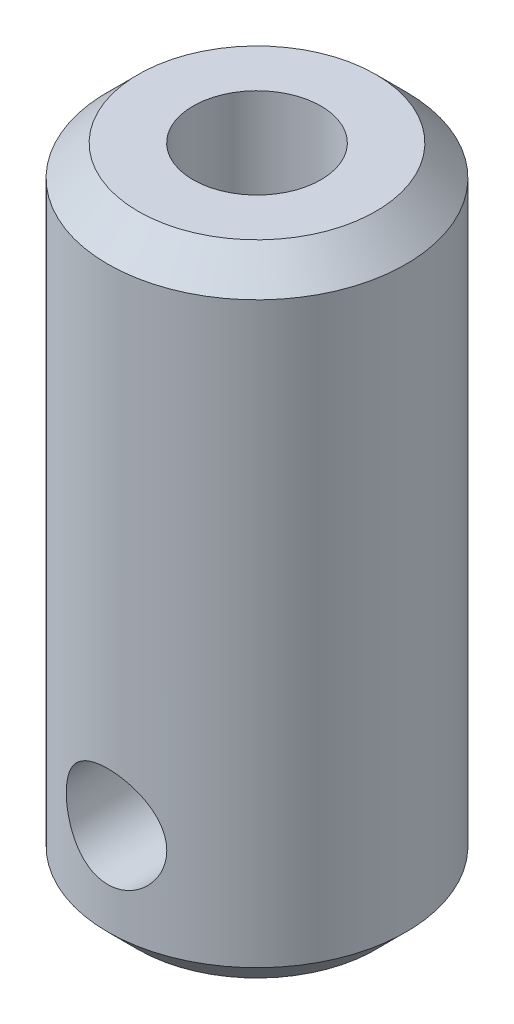
ISO-10303-21;
HEADER;
FILE_DESCRIPTION(('STEP AP214'),'2;1');
FILE_NAME('part.step','',(''),(''),'','','');
FILE_SCHEMA(('AUTOMOTIVE_DESIGN { 1 0 10303 214 1 1 1 1 }'));
ENDSEC;
DATA;
#1=APPLICATION_CONTEXT('core data for automotive mechanical design processes');
#2=APPLICATION_PROTOCOL_DEFINITION('international standard','automotive_design',2000,#1);
#3=PRODUCT_CONTEXT('',#1,'mechanical');
#4=PRODUCT('Part','Part','',(#3));
#5=PRODUCT_RELATED_PRODUCT_CATEGORY('part','',(#4));
#6=PRODUCT_DEFINITION_FORMATION('','',#4);
#7=PRODUCT_DEFINITION_CONTEXT('part definition',#1,'design');
#8=PRODUCT_DEFINITION('design','',#6,#7);
#9=PRODUCT_DEFINITION_SHAPE('','',#8);
#10=(LENGTH_UNIT() NAMED_UNIT(*) SI_UNIT(.MILLI.,.METRE.));
#11=(NAMED_UNIT(*) PLANE_ANGLE_UNIT() SI_UNIT($,.RADIAN.));
#12=(NAMED_UNIT(*) SI_UNIT($,.STERADIAN.) SOLID_ANGLE_UNIT());
#13=UNCERTAINTY_MEASURE_WITH_UNIT(LENGTH_MEASURE(1.E-05),#10,'distance_accuracy_value','');
#14=(GEOMETRIC_REPRESENTATION_CONTEXT(3) GLOBAL_UNCERTAINTY_ASSIGNED_CONTEXT((#13)) GLOBAL_UNIT_ASSIGNED_CONTEXT((#10,
#11,#12)) REPRESENTATION_CONTEXT('',''));
#15=CARTESIAN_POINT('',(0.,0.,0.));
#16=DIRECTION('',(0.,0.,1.));
#17=DIRECTION('',(1.,0.,0.));
#18=AXIS2_PLACEMENT_3D('',#15,#16,#17);
#19=CARTESIAN_POINT('',(0.,21.,0.));
#20=DIRECTION('',(0.,-1.,0.));
#21=DIRECTION('',(0.,0.,-1.));
#22=AXIS2_PLACEMENT_3D('',#19,#20,#21);
#23=CYLINDRICAL_SURFACE('',#22,4.9);
#24=CARTESIAN_POINT('',(0.,1.00000000000002,0.));
#25=DIRECTION('',(0.,1.,0.));
#26=DIRECTION('',(0.,0.,1.));
#27=AXIS2_PLACEMENT_3D('',#24,#25,#26);
#28=CIRCLE('',#27,4.9);
#29=CARTESIAN_POINT('',(0.,1.00000000000002,4.9));
#30=VERTEX_POINT('',#29);
#31=EDGE_CURVE('E101',#30,#30,#28,.T.);
#32=ORIENTED_EDGE('',*,*,#31,.T.);
#33=EDGE_LOOP('',(#32));
#34=FACE_BOUND('',#33,.T.);
#35=CARTESIAN_POINT('',(0.,20.,0.));
#36=DIRECTION('',(0.,1.,0.));
#37=DIRECTION('',(0.,0.,1.));
#38=AXIS2_PLACEMENT_3D('',#35,#36,#37);
#39=CIRCLE('',#38,4.9);
#40=CARTESIAN_POINT('',(0.,20.,4.9));
#41=VERTEX_POINT('',#40);
#42=EDGE_CURVE('E105',#41,#41,#39,.F.);
#43=ORIENTED_EDGE('',*,*,#42,.T.);
#44=EDGE_LOOP('',(#43));
#45=FACE_BOUND('',#44,.T.);
#46=CARTESIAN_POINT('',(0.,5.65,-4.9));
#47=CARTESIAN_POINT('',(-0.0899772794896304,5.65000060464146,-4.90000038791869));
#48=CARTESIAN_POINT('',(-0.179950550455029,5.64261620198072,-4.89749890439185));
#49=CARTESIAN_POINT('',(-0.357243830798704,5.61336632209398,-4.88776666165979));
#50=CARTESIAN_POINT('',(-0.44456361774687,5.5914996343635,-4.88053550712478));
#51=CARTESIAN_POINT('',(-0.613968367145328,5.53412191168275,-4.8621289144439));
#52=CARTESIAN_POINT('',(-0.696061915233231,5.49863396530345,-4.85096015329265));
#53=CARTESIAN_POINT('',(-0.853131449248442,5.4151264780541,-4.82581616548723));
#54=CARTESIAN_POINT('',(-0.928105982231245,5.36710438651214,-4.81184036774064));
#55=CARTESIAN_POINT('',(-1.07145261780115,5.25811433593205,-4.78199989362341));
#56=CARTESIAN_POINT('',(-1.1395391574267,5.1967834442565,-4.76608930241227));
#57=CARTESIAN_POINT('',(-1.26467956457131,5.06368826270549,-4.73442291223427));
#58=CARTESIAN_POINT('',(-1.32173093537596,4.99192161815291,-4.71866714906096));
#59=CARTESIAN_POINT('',(-1.42482571433906,4.83740438331534,-4.68858693839304));
#60=CARTESIAN_POINT('',(-1.4704954365696,4.75439254951675,-4.67431831154573));
#61=CARTESIAN_POINT('',(-1.547103412454,4.58130846147901,-4.64952731093173));
#62=CARTESIAN_POINT('',(-1.57804626715083,4.49123842265614,-4.63900376736657));
#63=CARTESIAN_POINT('',(-1.62324646549038,4.30984556306304,-4.623378492492));
#64=CARTESIAN_POINT('',(-1.63803973603628,4.21867168831421,-4.61810316811064));
#65=CARTESIAN_POINT('',(-1.65219630303995,4.03499504346687,-4.61305855746477));
#66=CARTESIAN_POINT('',(-1.65156448405094,3.94249270331698,-4.61328752819399));
#67=CARTESIAN_POINT('',(-1.63530441900032,3.7633801134491,-4.61907369878178));
#68=CARTESIAN_POINT('',(-1.62037879571232,3.67669660726153,-4.62438124702715));
#69=CARTESIAN_POINT('',(-1.57710221034144,3.50714457451636,-4.63931754092689));
#70=CARTESIAN_POINT('',(-1.54874960993472,3.42427651486358,-4.64894681389905));
#71=CARTESIAN_POINT('',(-1.47896990910225,3.26312430024659,-4.67161725774667));
#72=CARTESIAN_POINT('',(-1.43733668695831,3.1849372043534,-4.68471162193192));
#73=CARTESIAN_POINT('',(-1.34232067014667,3.03643833278612,-4.71281491298858));
#74=CARTESIAN_POINT('',(-1.28893442615412,2.96612887823417,-4.72782440137364));
#75=CARTESIAN_POINT('',(-1.16856571945658,2.83143728084126,-4.75904561062351));
#76=CARTESIAN_POINT('',(-1.10100985162213,2.76757146961487,-4.77527875045023));
#77=CARTESIAN_POINT('',(-0.955947768304286,2.65193916789953,-4.80641866433893));
#78=CARTESIAN_POINT('',(-0.878440560120905,2.60017388595888,-4.82132530582401));
#79=CARTESIAN_POINT('',(-0.714563768137236,2.50978492979003,-4.84833537767025));
#80=CARTESIAN_POINT('',(-0.628111084971806,2.47130218341345,-4.86040833654256));
#81=CARTESIAN_POINT('',(-0.449455010213594,2.4095871555326,-4.88016922966956));
#82=CARTESIAN_POINT('',(-0.357253671758919,2.38634946302118,-4.88785871964477));
#83=CARTESIAN_POINT('',(-0.174086694882145,2.3567049149936,-4.89772732847351));
#84=CARTESIAN_POINT('',(-0.0832460898984117,2.34960055459547,-4.90013464977819));
#85=CARTESIAN_POINT('',(0.0983489727626962,2.35043400558215,-4.89985371268991));
#86=CARTESIAN_POINT('',(0.189103442610372,2.35836921884401,-4.89716633441869));
#87=CARTESIAN_POINT('',(0.365141192906475,2.38850615353647,-4.88714863077872));
#88=CARTESIAN_POINT('',(0.450506912031592,2.41027752369806,-4.87995845296456));
#89=CARTESIAN_POINT('',(0.616337885965851,2.46692850650763,-4.86179920053171));
#90=CARTESIAN_POINT('',(0.69680251198387,2.50180979700813,-4.85082964222992));
#91=CARTESIAN_POINT('',(0.852933671835093,2.58471749626265,-4.82585999533039));
#92=CARTESIAN_POINT('',(0.928415671586987,2.63306884883987,-4.81178706398892));
#93=CARTESIAN_POINT('',(1.07042023533106,2.74116364046411,-4.78220350422765));
#94=CARTESIAN_POINT('',(1.1369400026767,2.80091062150928,-4.76669242957538));
#95=CARTESIAN_POINT('',(1.26234667704003,2.93337970239732,-4.73506701224516));
#96=CARTESIAN_POINT('',(1.32073594481882,3.00657535486052,-4.71895808841253));
#97=CARTESIAN_POINT('',(1.42446722625939,3.16207007830456,-4.68869090323433));
#98=CARTESIAN_POINT('',(1.46980906737263,3.24436926965721,-4.67453266768737));
#99=CARTESIAN_POINT('',(1.54596335328321,3.41581106183231,-4.64990386642468));
#100=CARTESIAN_POINT('',(1.57679975425569,3.50494209445932,-4.6394272277316));
#101=CARTESIAN_POINT('',(1.6228813846772,3.68756758525814,-4.62351186297584));
#102=CARTESIAN_POINT('',(1.63813382948524,3.78106000312653,-4.61807080555317));
#103=CARTESIAN_POINT('',(1.65204484473692,3.96448289540318,-4.61311139144736));
#104=CARTESIAN_POINT('',(1.6515310848963,4.05434329532637,-4.61329761428516));
#105=CARTESIAN_POINT('',(1.63596778526243,4.23262565569331,-4.61883925530788));
#106=CARTESIAN_POINT('',(1.62091914482643,4.32104770479195,-4.62419435366452));
#107=CARTESIAN_POINT('',(1.57730413644212,4.49219934449872,-4.63924822601539));
#108=CARTESIAN_POINT('',(1.54901112485278,4.57500695062302,-4.64885895854189));
#109=CARTESIAN_POINT('',(1.47993329208238,4.73476238823085,-4.67130711942719));
#110=CARTESIAN_POINT('',(1.43914566270712,4.81170889755999,-4.68414527303989));
#111=CARTESIAN_POINT('',(1.34412551404985,4.96125933201271,-4.71231180165105));
#112=CARTESIAN_POINT('',(1.28937674238835,5.03351909107709,-4.72772539348958));
#113=CARTESIAN_POINT('',(1.16885530831289,5.16809286087386,-4.75895448842747));
#114=CARTESIAN_POINT('',(1.10307949931577,5.23040402282101,-4.77477010514934));
#115=CARTESIAN_POINT('',(0.959206319984846,5.34583161114387,-4.80578232220498));
#116=CARTESIAN_POINT('',(0.880720748755575,5.39847938447217,-4.82092870193237));
#117=CARTESIAN_POINT('',(0.715511829730928,5.48977987638329,-4.84819957124039));
#118=CARTESIAN_POINT('',(0.628790394973416,5.52843583501603,-4.86032476022777));
#119=CARTESIAN_POINT('',(0.452942851391895,5.58923415878093,-4.87979151905399));
#120=CARTESIAN_POINT('',(0.36403260361944,5.61194709982662,-4.88729703860754));
#121=CARTESIAN_POINT('',(0.183412968669279,5.64232752727171,-4.89740036865913));
#122=CARTESIAN_POINT('',(0.0917044023900253,5.64999938375239,-4.89999960463517));
#123=CARTESIAN_POINT('',(0.,5.65,-4.9));
#124=B_SPLINE_CURVE_WITH_KNOTS('',3,(#46,#47,#48,#49,#50,#51,#52,#53,#54,#55,#56,#57,#58,#59,
#60,#61,#62,#63,#64,#65,#66,#67,#68,#69,#70,#71,#72,#73,#74,#75,#76,#77,#78,#79,#80,#81,#82,#83,
#84,#85,#86,#87,#88,#89,#90,#91,#92,#93,#94,#95,#96,#97,#98,#99,#100,#101,#102,#103,#104,#105,
#106,#107,#108,#109,#110,#111,#112,#113,#114,#115,#116,#117,#118,#119,#120,#121,#122,#123),
.UNSPECIFIED.,.T.,.F.,(4,2,2,2,2,2,2,2,2,2,2,2,2,2,2,2,2,2,2,2,2,2,2,2,2,2,2,2,2,2,2,2,2,2,2,2,
2,2,4),(0.,0.269594308183774,0.539211153302105,0.808372991177138,1.07758964567766,
1.35536237997832,1.63319788722412,1.91921604910046,2.20514479297097,2.48126583078711,
2.75729943245581,3.02042554939657,3.28358378055793,3.55104319584596,3.81858121110666,
4.10039224367892,4.38223141029847,4.66697505791312,4.95161758520979,5.223698559487,
5.49573253539769,5.75969381362833,6.02368888603787,6.2947053921791,6.56580627356451,
6.84949134328304,7.13318016448437,7.41639880562234,7.69948625725712,7.96773935532175,
8.23597585607664,8.49890496721256,8.76189321568341,9.03655028201679,9.31128585601235,
9.59703343195235,9.88271479563614,10.1575638608962,10.4323330588535),.UNSPECIFIED.);
#125=CARTESIAN_POINT('',(0.,5.65,-4.9));
#126=VERTEX_POINT('',#125);
#127=EDGE_CURVE('E63',#126,#126,#124,.T.);
#128=ORIENTED_EDGE('',*,*,#127,.T.);
#129=EDGE_LOOP('',(#128));
#130=FACE_BOUND('',#129,.T.);
#131=CARTESIAN_POINT('',(1.65,4.,4.61383788185064));
#132=CARTESIAN_POINT('',(1.65000061826013,3.91018622223396,4.61383741638784));
#133=CARTESIAN_POINT('',(1.64264203896412,3.82037649379896,4.61648902868652));
#134=CARTESIAN_POINT('',(1.61350405268786,3.64342146354669,4.62675242808979));
#135=CARTESIAN_POINT('',(1.5917225144436,3.55627655749849,4.63436494825937));
#136=CARTESIAN_POINT('',(1.53459341170567,3.38724403113662,4.65359224203535));
#137=CARTESIAN_POINT('',(1.49927287810168,3.30534631254454,4.66519903629909));
#138=CARTESIAN_POINT('',(1.4161610097683,3.14861188739389,4.69109538211934));
#139=CARTESIAN_POINT('',(1.36836683622702,3.07377679346765,4.70538554416184));
#140=CARTESIAN_POINT('',(1.2596197021252,2.93030312041319,4.73567849827398));
#141=CARTESIAN_POINT('',(1.19825242353303,2.86198764267123,4.75172460314816));
#142=CARTESIAN_POINT('',(1.06498488639192,2.73639688446341,4.78335572567372));
#143=CARTESIAN_POINT('',(0.993082900429705,2.67912341816898,4.7989406672018));
#144=CARTESIAN_POINT('',(0.838417273941765,2.57576949916901,4.82839597766151));
#145=CARTESIAN_POINT('',(0.755414965953102,2.53002856624415,4.84220948634913));
#146=CARTESIAN_POINT('',(0.582349019455719,2.45328657732961,4.86605439187122));
#147=CARTESIAN_POINT('',(0.492287333560857,2.42228146207618,4.87608683011627));
#148=CARTESIAN_POINT('',(0.311047525716086,2.37698979687593,4.89093236595755));
#149=CARTESIAN_POINT('',(0.220022162893078,2.36214953659557,4.89591788182399));
#150=CARTESIAN_POINT('',(0.0366458571353626,2.34784719135327,4.90072039525904));
#151=CARTESIAN_POINT('',(-0.0557047309003399,2.3483810632341,4.90053875171023));
#152=CARTESIAN_POINT('',(-0.235186928740018,2.36446284238568,4.89514369864829));
#153=CARTESIAN_POINT('',(-0.322379504325787,2.37940910923578,4.89013192574893));
#154=CARTESIAN_POINT('',(-0.492937591357799,2.42289515261397,4.87589377741665));
#155=CARTESIAN_POINT('',(-0.576302841670502,2.45143585516639,4.86666711487606));
#156=CARTESIAN_POINT('',(-0.73814323933384,2.5216460893742,4.84478142949621));
#157=CARTESIAN_POINT('',(-0.816538740799303,2.56348494398242,4.83207845069587));
#158=CARTESIAN_POINT('',(-0.965372506411447,2.65896356057803,4.80455956847528));
#159=CARTESIAN_POINT('',(-1.03580851782116,2.71260665086469,4.78974306954631));
#160=CARTESIAN_POINT('',(-1.17030053479086,2.833192741132,4.75871720972646));
#161=CARTESIAN_POINT('',(-1.23388819953431,2.9006504289464,4.74247512826441));
#162=CARTESIAN_POINT('',(-1.34900194117804,3.04540738067901,4.71102573247564));
#163=CARTESIAN_POINT('',(-1.40052607899436,3.12270822370127,4.69581858478183));
#164=CARTESIAN_POINT('',(-1.49071671197138,3.28646906803758,4.66797956974422));
#165=CARTESIAN_POINT('',(-1.52918145703781,3.37304777465973,4.65538918352226));
#166=CARTESIAN_POINT('',(-1.59082564701159,3.55198446849131,4.63468916349996));
#167=CARTESIAN_POINT('',(-1.61401165590863,3.64433995520701,4.62657760576628));
#168=CARTESIAN_POINT('',(-1.64347807659181,3.82766423609059,4.61619043349539));
#169=CARTESIAN_POINT('',(-1.65048609014972,3.91850187189872,4.61366387213311));
#170=CARTESIAN_POINT('',(-1.64946164296023,4.10007122710816,4.61403058304539));
#171=CARTESIAN_POINT('',(-1.64143198636947,4.19080296310024,4.6169228448424));
#172=CARTESIAN_POINT('',(-1.61121444075725,4.36624375863268,4.62755076033307));
#173=CARTESIAN_POINT('',(-1.58953642404716,4.4510523566326,4.63511181049761));
#174=CARTESIAN_POINT('',(-1.53325162558441,4.61580977051476,4.65403211154475));
#175=CARTESIAN_POINT('',(-1.49864252234931,4.69575771077811,4.66539204439185));
#176=CARTESIAN_POINT('',(-1.41621195041342,4.85137876272631,4.69108297608795));
#177=CARTESIAN_POINT('',(-1.36800084164347,4.92683125791374,4.70549788236489));
#178=CARTESIAN_POINT('',(-1.26017419241338,5.06883805162643,4.73551350346967));
#179=CARTESIAN_POINT('',(-1.20055522396398,5.1353896652546,4.75111457388091));
#180=CARTESIAN_POINT('',(-1.06811854902206,5.2610948994323,4.78267424054711));
#181=CARTESIAN_POINT('',(-0.994795338780945,5.31972260003638,4.79861259143458));
#182=CARTESIAN_POINT('',(-0.838959214658453,5.4238779973428,4.82829471251658));
#183=CARTESIAN_POINT('',(-0.756446607156709,5.46940613061076,4.84203855584006));
#184=CARTESIAN_POINT('',(-0.584963460623604,5.54565928233716,4.86572222886383));
#185=CARTESIAN_POINT('',(-0.496038176696716,5.57647820554063,4.87568610398889));
#186=CARTESIAN_POINT('',(-0.313864377355276,5.62259320012081,4.89079012161));
#187=CARTESIAN_POINT('',(-0.220617471439904,5.63789500271568,4.89593204503164));
#188=CARTESIAN_POINT('',(-0.0372530306954997,5.65201728181243,4.90067565580974));
#189=CARTESIAN_POINT('',(0.0528004719434228,5.65159205976993,4.90053090751275));
#190=CARTESIAN_POINT('',(0.231493223876888,5.63613923928317,4.89534460695464));
#191=CARTESIAN_POINT('',(0.320132591258914,5.62111286666524,4.89030346576574));
#192=CARTESIAN_POINT('',(0.492023220498186,5.57738755965385,4.8759857318464));
#193=CARTESIAN_POINT('',(0.575339225773232,5.54891815098851,4.86678034604106));
#194=CARTESIAN_POINT('',(0.73604256240583,5.47932850459625,4.84508239028603));
#195=CARTESIAN_POINT('',(0.813428810956177,5.43820596317914,4.83258922180682));
#196=CARTESIAN_POINT('',(0.963234092477962,5.34270748456175,4.8050182135104));
#197=CARTESIAN_POINT('',(1.03535890495902,5.28789319997856,4.7898611509712));
#198=CARTESIAN_POINT('',(1.16963203566155,5.16730841181274,4.75885682358321));
#199=CARTESIAN_POINT('',(1.23177712521106,5.10153437646337,4.74300933746596));
#200=CARTESIAN_POINT('',(1.34686759761613,4.95773838887022,4.71165075173436));
#201=CARTESIAN_POINT('',(1.3993429927178,4.8793304959504,4.69617875446858));
#202=CARTESIAN_POINT('',(1.49033873673623,4.71432552243888,4.6681012233117));
#203=CARTESIAN_POINT('',(1.52886237527542,4.627730378363,4.65549501397056));
#204=CARTESIAN_POINT('',(1.58944341283123,4.4521688579169,4.63515458734399));
#205=CARTESIAN_POINT('',(1.61207623528538,4.36342117668457,4.62725189577735));
#206=CARTESIAN_POINT('',(1.64235148330365,4.18311356980125,4.61659471799071));
#207=CARTESIAN_POINT('',(1.64999936975584,4.09155468098429,4.61383835633573));
#208=CARTESIAN_POINT('',(1.65,4.,4.61383788185064));
#209=B_SPLINE_CURVE_WITH_KNOTS('',3,(#131,#132,#133,#134,#135,#136,#137,#138,#139,#140,#141,
#142,#143,#144,#145,#146,#147,#148,#149,#150,#151,#152,#153,#154,#155,#156,#157,#158,#159,#160,
#161,#162,#163,#164,#165,#166,#167,#168,#169,#170,#171,#172,#173,#174,#175,#176,#177,#178,#179,
#180,#181,#182,#183,#184,#185,#186,#187,#188,#189,#190,#191,#192,#193,#194,#195,#196,#197,#198,
#199,#200,#201,#202,#203,#204,#205,#206,#207,#208),.UNSPECIFIED.,.T.,.F.,(4,2,2,2,2,2,2,2,2,2,2,
2,2,2,2,2,2,2,2,2,2,2,2,2,2,2,2,2,2,2,2,2,2,2,2,2,2,2,4),(0.,0.269102142039234,
0.538244057868016,0.806851401650253,1.07551992979177,1.35393092208069,1.63238761760394,
1.91827591481017,2.2040854128872,2.47976293671465,2.75536796231048,3.01994467186662,
3.28453940640933,3.55264807655731,3.82083243918692,4.10188589537131,4.38298449694958,
4.66824670239064,4.95338627458246,5.22542861262789,5.49742022650095,5.7598090396497,
6.02224498139305,6.29313341544777,6.56410337795041,6.84842140135261,7.13272994826958,
7.41519832999542,7.69756234453574,7.96640197756181,8.23521904235063,8.49960370816546,
8.76403653763409,9.03836411653035,9.31278026873824,9.59822274214104,9.88359786845123,
10.1580161689934,10.4323344459817),.UNSPECIFIED.);
#210=CARTESIAN_POINT('',(1.65,4.,4.61383788185064));
#211=VERTEX_POINT('',#210);
#212=EDGE_CURVE('E59',#211,#211,#209,.T.);
#213=ORIENTED_EDGE('',*,*,#212,.T.);
#214=EDGE_LOOP('',(#213));
#215=FACE_BOUND('',#214,.T.);
#216=ADVANCED_FACE('F39',(#34,#45,#130,#215),#23,.T.);
#217=CARTESIAN_POINT('',(0.,21.,0.));
#218=DIRECTION('',(0.,1.,0.));
#219=DIRECTION('',(0.,0.,1.));
#220=AXIS2_PLACEMENT_3D('',#217,#218,#219);
#221=PLANE('',#220);
#222=CARTESIAN_POINT('',(0.,21.,0.));
#223=DIRECTION('',(0.,1.,0.));
#224=DIRECTION('',(0.,0.,1.));
#225=AXIS2_PLACEMENT_3D('',#222,#223,#224);
#226=CIRCLE('',#225,3.90000000000001);
#227=CARTESIAN_POINT('',(0.,21.,3.90000000000001));
#228=VERTEX_POINT('',#227);
#229=EDGE_CURVE('E11',#228,#228,#226,.T.);
#230=ORIENTED_EDGE('',*,*,#229,.T.);
#231=EDGE_LOOP('',(#230));
#232=FACE_BOUND('',#231,.T.);
#233=CARTESIAN_POINT('',(0.,21.,0.));
#234=DIRECTION('',(0.,1.,0.));
#235=DIRECTION('',(0.,0.,1.));
#236=AXIS2_PLACEMENT_3D('',#233,#234,#235);
#237=CIRCLE('',#236,2.1);
#238=CARTESIAN_POINT('',(0.,21.,2.1));
#239=VERTEX_POINT('',#238);
#240=EDGE_CURVE('E60',#239,#239,#237,.T.);
#241=ORIENTED_EDGE('',*,*,#240,.F.);
#242=EDGE_LOOP('',(#241));
#243=FACE_BOUND('',#242,.T.);
#244=ADVANCED_FACE('F85',(#232,#243),#221,.T.);
#245=CARTESIAN_POINT('',(0.,0.,0.));
#246=DIRECTION('',(0.,1.,0.));
#247=DIRECTION('',(0.,0.,1.));
#248=AXIS2_PLACEMENT_3D('',#245,#246,#247);
#249=PLANE('',#248);
#250=CARTESIAN_POINT('',(0.,0.,0.));
#251=DIRECTION('',(0.,1.,0.));
#252=DIRECTION('',(0.,0.,1.));
#253=AXIS2_PLACEMENT_3D('',#250,#251,#252);
#254=CIRCLE('',#253,3.89999999999998);
#255=CARTESIAN_POINT('',(0.,0.,3.89999999999998));
#256=VERTEX_POINT('',#255);
#257=EDGE_CURVE('E46',#256,#256,#254,.F.);
#258=ORIENTED_EDGE('',*,*,#257,.T.);
#259=EDGE_LOOP('',(#258));
#260=FACE_BOUND('',#259,.T.);
#261=ADVANCED_FACE('F82',(#260),#249,.F.);
#262=CARTESIAN_POINT('',(0.,4.,4.9));
#263=DIRECTION('',(0.,0.,1.));
#264=DIRECTION('',(1.,0.,0.));
#265=AXIS2_PLACEMENT_3D('',#262,#263,#264);
#266=CYLINDRICAL_SURFACE('',#265,1.65);
#267=ORIENTED_EDGE('',*,*,#212,.F.);
#268=EDGE_LOOP('',(#267));
#269=FACE_BOUND('',#268,.T.);
#270=ORIENTED_EDGE('',*,*,#127,.F.);
#271=EDGE_LOOP('',(#270));
#272=FACE_BOUND('',#271,.T.);
#273=ADVANCED_FACE('F53',(#269,#272),#266,.F.);
#274=CARTESIAN_POINT('',(0.,9.,0.));
#275=DIRECTION('',(0.,1.,0.));
#276=DIRECTION('',(0.,0.,1.));
#277=AXIS2_PLACEMENT_3D('',#274,#275,#276);
#278=CONICAL_SURFACE('',#277,2.1,1.02974425867665);
#279=CARTESIAN_POINT('',(0.,7.73819270004212,0.));
#280=VERTEX_POINT('',#279);
#281=VERTEX_LOOP('',#280);
#282=FACE_BOUND('',#281,.T.);
#283=CARTESIAN_POINT('',(0.,9.,0.));
#284=DIRECTION('',(0.,1.,0.));
#285=DIRECTION('',(0.,0.,1.));
#286=AXIS2_PLACEMENT_3D('',#283,#284,#285);
#287=CIRCLE('',#286,2.1);
#288=CARTESIAN_POINT('',(0.,9.,2.1));
#289=VERTEX_POINT('',#288);
#290=EDGE_CURVE('E57',#289,#289,#287,.T.);
#291=ORIENTED_EDGE('',*,*,#290,.T.);
#292=EDGE_LOOP('',(#291));
#293=FACE_BOUND('',#292,.T.);
#294=ADVANCED_FACE('F49',(#282,#293),#278,.F.);
#295=CARTESIAN_POINT('',(0.,21.,0.));
#296=DIRECTION('',(0.,1.,0.));
#297=DIRECTION('',(0.,0.,1.));
#298=AXIS2_PLACEMENT_3D('',#295,#296,#297);
#299=CYLINDRICAL_SURFACE('',#298,2.1);
#300=ORIENTED_EDGE('',*,*,#290,.F.);
#301=EDGE_LOOP('',(#300));
#302=FACE_BOUND('',#301,.T.);
#303=ORIENTED_EDGE('',*,*,#240,.T.);
#304=EDGE_LOOP('',(#303));
#305=FACE_BOUND('',#304,.T.);
#306=ADVANCED_FACE('F52',(#302,#305),#299,.F.);
#307=CARTESIAN_POINT('',(0.,1.00000000000002,0.));
#308=DIRECTION('',(0.,1.,0.));
#309=DIRECTION('',(0.,0.,1.));
#310=AXIS2_PLACEMENT_3D('',#307,#308,#309);
#311=CONICAL_SURFACE('',#310,4.9,0.78539816339745);
#312=ORIENTED_EDGE('',*,*,#257,.F.);
#313=EDGE_LOOP('',(#312));
#314=FACE_BOUND('',#313,.T.);
#315=ORIENTED_EDGE('',*,*,#31,.F.);
#316=EDGE_LOOP('',(#315));
#317=FACE_BOUND('',#316,.T.);
#318=ADVANCED_FACE('F114',(#314,#317),#311,.T.);
#319=CARTESIAN_POINT('',(0.,21.,0.));
#320=DIRECTION('',(0.,-1.,0.));
#321=DIRECTION('',(0.,0.,-1.));
#322=AXIS2_PLACEMENT_3D('',#319,#320,#321);
#323=CONICAL_SURFACE('',#322,3.90000000000001,0.785398163397447);
#324=ORIENTED_EDGE('',*,*,#42,.F.);
#325=EDGE_LOOP('',(#324));
#326=FACE_BOUND('',#325,.T.);
#327=ORIENTED_EDGE('',*,*,#229,.F.);
#328=EDGE_LOOP('',(#327));
#329=FACE_BOUND('',#328,.T.);
#330=ADVANCED_FACE('F41',(#326,#329),#323,.T.);
#331=CLOSED_SHELL('',(#216,#244,#261,#273,#294,#306,#318,#330));
#332=MANIFOLD_SOLID_BREP('B2',#331);
#333=ADVANCED_BREP_SHAPE_REPRESENTATION('',(#18,#332),#14);
#334=SHAPE_DEFINITION_REPRESENTATION(#9,#333);
ENDSEC;
END-ISO-10303-21;
